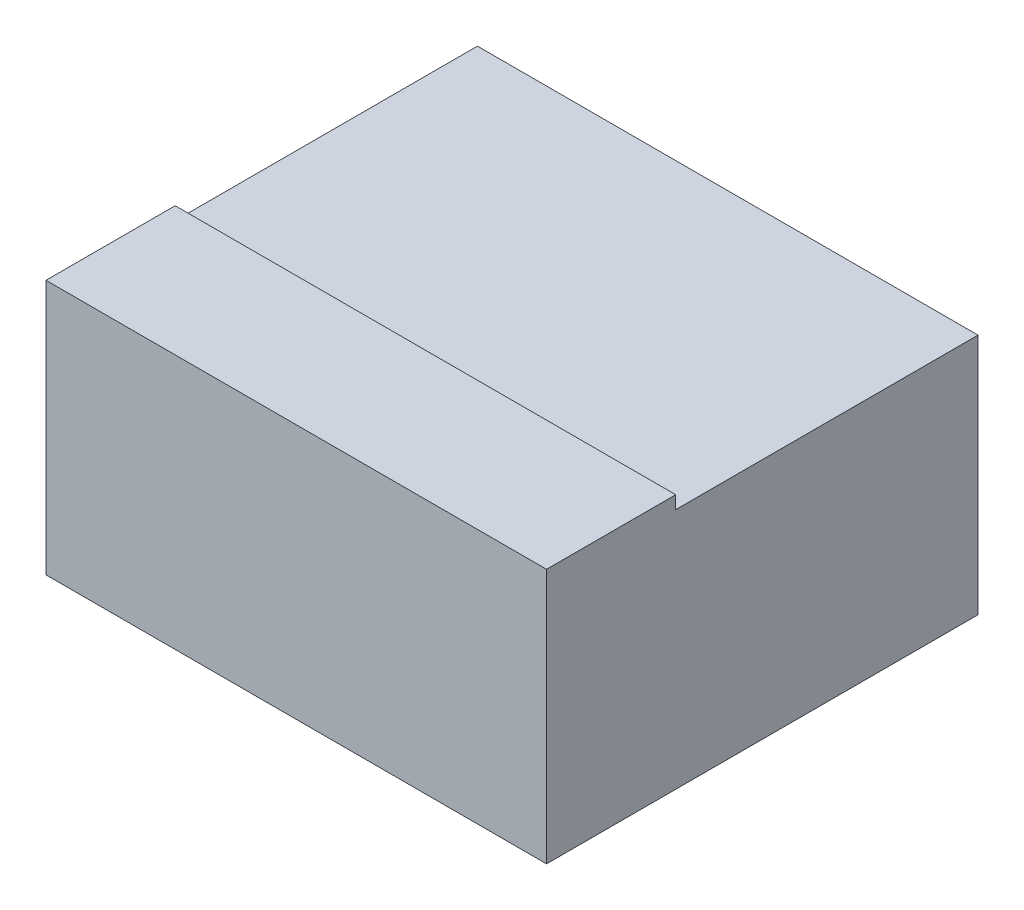
ISO-10303-21;
HEADER;
FILE_DESCRIPTION(('STEP AP214'),'2;1');
FILE_NAME('part.step','',(''),(''),'','','');
FILE_SCHEMA(('AUTOMOTIVE_DESIGN { 1 0 10303 214 1 1 1 1 }'));
ENDSEC;
DATA;
#1=APPLICATION_CONTEXT('core data for automotive mechanical design processes');
#2=APPLICATION_PROTOCOL_DEFINITION('international standard','automotive_design',2000,#1);
#3=PRODUCT_CONTEXT('',#1,'mechanical');
#4=PRODUCT('Part','Part','',(#3));
#5=PRODUCT_RELATED_PRODUCT_CATEGORY('part','',(#4));
#6=PRODUCT_DEFINITION_FORMATION('','',#4);
#7=PRODUCT_DEFINITION_CONTEXT('part definition',#1,'design');
#8=PRODUCT_DEFINITION('design','',#6,#7);
#9=PRODUCT_DEFINITION_SHAPE('','',#8);
#10=(LENGTH_UNIT() NAMED_UNIT(*) SI_UNIT(.MILLI.,.METRE.));
#11=(NAMED_UNIT(*) PLANE_ANGLE_UNIT() SI_UNIT($,.RADIAN.));
#12=(NAMED_UNIT(*) SI_UNIT($,.STERADIAN.) SOLID_ANGLE_UNIT());
#13=UNCERTAINTY_MEASURE_WITH_UNIT(LENGTH_MEASURE(1.E-05),#10,'distance_accuracy_value','');
#14=(GEOMETRIC_REPRESENTATION_CONTEXT(3) GLOBAL_UNCERTAINTY_ASSIGNED_CONTEXT((#13)) GLOBAL_UNIT_ASSIGNED_CONTEXT((#10,
#11,#12)) REPRESENTATION_CONTEXT('',''));
#15=CARTESIAN_POINT('',(0.,0.,0.));
#16=DIRECTION('',(0.,0.,1.));
#17=DIRECTION('',(1.,0.,0.));
#18=AXIS2_PLACEMENT_3D('',#15,#16,#17);
#19=CARTESIAN_POINT('',(-38.75,37.5,-33.4));
#20=DIRECTION('',(1.,0.,0.));
#21=DIRECTION('',(0.,0.,-1.));
#22=AXIS2_PLACEMENT_3D('',#19,#20,#21);
#23=PLANE('',#22);
#24=DIRECTION('',(0.,0.,-1.));
#25=VECTOR('',#24,1.);
#26=CARTESIAN_POINT('',(-38.75,12.,-33.4));
#27=LINE('',#26,#25);
#28=CARTESIAN_POINT('',(-38.75,12.,-21.4));
#29=VERTEX_POINT('',#28);
#30=CARTESIAN_POINT('',(-38.75,12.,-33.4));
#31=VERTEX_POINT('',#30);
#32=EDGE_CURVE('E134',#29,#31,#27,.T.);
#33=ORIENTED_EDGE('',*,*,#32,.F.);
#34=DIRECTION('',(0.,1.,0.));
#35=VECTOR('',#34,1.);
#36=CARTESIAN_POINT('',(-38.75,0.,-21.4));
#37=LINE('',#36,#35);
#38=CARTESIAN_POINT('',(-38.75,0.,-21.4));
#39=VERTEX_POINT('',#38);
#40=EDGE_CURVE('E56',#39,#29,#37,.T.);
#41=ORIENTED_EDGE('',*,*,#40,.F.);
#42=DIRECTION('',(0.,0.,1.));
#43=VECTOR('',#42,1.);
#44=CARTESIAN_POINT('',(-38.75,0.,-33.4));
#45=LINE('',#44,#43);
#46=CARTESIAN_POINT('',(-38.75,0.,33.4));
#47=VERTEX_POINT('',#46);
#48=EDGE_CURVE('E118',#39,#47,#45,.T.);
#49=ORIENTED_EDGE('',*,*,#48,.T.);
#50=DIRECTION('',(0.,-1.,0.));
#51=VECTOR('',#50,1.);
#52=CARTESIAN_POINT('',(-38.75,37.5,33.4));
#53=LINE('',#52,#51);
#54=CARTESIAN_POINT('',(-38.75,39.5,33.4));
#55=VERTEX_POINT('',#54);
#56=EDGE_CURVE('E181',#55,#47,#53,.T.);
#57=ORIENTED_EDGE('',*,*,#56,.F.);
#58=DIRECTION('',(0.,0.,1.));
#59=VECTOR('',#58,1.);
#60=CARTESIAN_POINT('',(-38.75,39.5,33.4));
#61=LINE('',#60,#59);
#62=CARTESIAN_POINT('',(-38.75,39.5,13.4));
#63=VERTEX_POINT('',#62);
#64=EDGE_CURVE('E153',#63,#55,#61,.T.);
#65=ORIENTED_EDGE('',*,*,#64,.F.);
#66=DIRECTION('',(0.,-1.,0.));
#67=VECTOR('',#66,1.);
#68=CARTESIAN_POINT('',(-38.75,39.5,13.4));
#69=LINE('',#68,#67);
#70=CARTESIAN_POINT('',(-38.75,37.5,13.4));
#71=VERTEX_POINT('',#70);
#72=EDGE_CURVE('E157',#63,#71,#69,.T.);
#73=ORIENTED_EDGE('',*,*,#72,.T.);
#74=DIRECTION('',(0.,0.,1.));
#75=VECTOR('',#74,1.);
#76=CARTESIAN_POINT('',(-38.75,37.5,-33.4));
#77=LINE('',#76,#75);
#78=CARTESIAN_POINT('',(-38.75,37.5,-33.4));
#79=VERTEX_POINT('',#78);
#80=EDGE_CURVE('E173',#79,#71,#77,.T.);
#81=ORIENTED_EDGE('',*,*,#80,.F.);
#82=DIRECTION('',(0.,-1.,0.));
#83=VECTOR('',#82,1.);
#84=CARTESIAN_POINT('',(-38.75,37.5,-33.4));
#85=LINE('',#84,#83);
#86=EDGE_CURVE('E50',#79,#31,#85,.T.);
#87=ORIENTED_EDGE('',*,*,#86,.T.);
#88=EDGE_LOOP('',(#33,#41,#49,#57,#65,#73,#81,#87));
#89=FACE_BOUND('',#88,.T.);
#90=ADVANCED_FACE('F39',(#89),#23,.F.);
#91=CARTESIAN_POINT('',(38.75,37.5,-33.4));
#92=DIRECTION('',(-1.,0.,0.));
#93=DIRECTION('',(0.,0.,1.));
#94=AXIS2_PLACEMENT_3D('',#91,#92,#93);
#95=PLANE('',#94);
#96=DIRECTION('',(0.,0.,-1.));
#97=VECTOR('',#96,1.);
#98=CARTESIAN_POINT('',(38.75,0.,-33.4));
#99=LINE('',#98,#97);
#100=CARTESIAN_POINT('',(38.75,0.,33.4));
#101=VERTEX_POINT('',#100);
#102=CARTESIAN_POINT('',(38.75,0.,-33.4));
#103=VERTEX_POINT('',#102);
#104=EDGE_CURVE('E119',#101,#103,#99,.T.);
#105=ORIENTED_EDGE('',*,*,#104,.T.);
#106=DIRECTION('',(0.,-1.,0.));
#107=VECTOR('',#106,1.);
#108=CARTESIAN_POINT('',(38.75,37.5,-33.4));
#109=LINE('',#108,#107);
#110=CARTESIAN_POINT('',(38.75,37.5,-33.4));
#111=VERTEX_POINT('',#110);
#112=EDGE_CURVE('E11',#111,#103,#109,.T.);
#113=ORIENTED_EDGE('',*,*,#112,.F.);
#114=DIRECTION('',(0.,0.,-1.));
#115=VECTOR('',#114,1.);
#116=CARTESIAN_POINT('',(38.75,37.5,-33.4));
#117=LINE('',#116,#115);
#118=CARTESIAN_POINT('',(38.75,37.5,13.4));
#119=VERTEX_POINT('',#118);
#120=EDGE_CURVE('E166',#119,#111,#117,.T.);
#121=ORIENTED_EDGE('',*,*,#120,.F.);
#122=DIRECTION('',(0.,-1.,0.));
#123=VECTOR('',#122,1.);
#124=CARTESIAN_POINT('',(38.75,39.5,13.4));
#125=LINE('',#124,#123);
#126=CARTESIAN_POINT('',(38.75,39.5,13.4));
#127=VERTEX_POINT('',#126);
#128=EDGE_CURVE('E164',#127,#119,#125,.T.);
#129=ORIENTED_EDGE('',*,*,#128,.F.);
#130=DIRECTION('',(0.,0.,-1.));
#131=VECTOR('',#130,1.);
#132=CARTESIAN_POINT('',(38.75,39.5,33.4));
#133=LINE('',#132,#131);
#134=CARTESIAN_POINT('',(38.75,39.5,33.4));
#135=VERTEX_POINT('',#134);
#136=EDGE_CURVE('E146',#135,#127,#133,.T.);
#137=ORIENTED_EDGE('',*,*,#136,.F.);
#138=DIRECTION('',(0.,-1.,0.));
#139=VECTOR('',#138,1.);
#140=CARTESIAN_POINT('',(38.75,37.5,33.4));
#141=LINE('',#140,#139);
#142=EDGE_CURVE('E174',#135,#101,#141,.T.);
#143=ORIENTED_EDGE('',*,*,#142,.T.);
#144=EDGE_LOOP('',(#105,#113,#121,#129,#137,#143));
#145=FACE_BOUND('',#144,.T.);
#146=ADVANCED_FACE('F41',(#145),#95,.F.);
#147=CARTESIAN_POINT('',(-38.75,37.5,-33.4));
#148=DIRECTION('',(0.,0.,1.));
#149=DIRECTION('',(1.,0.,0.));
#150=AXIS2_PLACEMENT_3D('',#147,#148,#149);
#151=PLANE('',#150);
#152=DIRECTION('',(-1.,0.,0.));
#153=VECTOR('',#152,1.);
#154=CARTESIAN_POINT('',(-38.75,0.,-33.4));
#155=LINE('',#154,#153);
#156=CARTESIAN_POINT('',(-43.75,0.,-33.4));
#157=VERTEX_POINT('',#156);
#158=EDGE_CURVE('E108',#103,#157,#155,.T.);
#159=ORIENTED_EDGE('',*,*,#158,.T.);
#160=DIRECTION('',(0.,-1.,0.));
#161=VECTOR('',#160,1.);
#162=CARTESIAN_POINT('',(-43.75,0.,-33.4));
#163=LINE('',#162,#161);
#164=CARTESIAN_POINT('',(-43.75,12.,-33.4));
#165=VERTEX_POINT('',#164);
#166=EDGE_CURVE('E113',#165,#157,#163,.T.);
#167=ORIENTED_EDGE('',*,*,#166,.F.);
#168=DIRECTION('',(1.,0.,0.));
#169=VECTOR('',#168,1.);
#170=CARTESIAN_POINT('',(-43.75,12.,-33.4));
#171=LINE('',#170,#169);
#172=EDGE_CURVE('E142',#165,#31,#171,.T.);
#173=ORIENTED_EDGE('',*,*,#172,.T.);
#174=ORIENTED_EDGE('',*,*,#86,.F.);
#175=DIRECTION('',(-1.,0.,0.));
#176=VECTOR('',#175,1.);
#177=CARTESIAN_POINT('',(-38.75,37.5,-33.4));
#178=LINE('',#177,#176);
#179=EDGE_CURVE('E167',#111,#79,#178,.T.);
#180=ORIENTED_EDGE('',*,*,#179,.F.);
#181=ORIENTED_EDGE('',*,*,#112,.T.);
#182=EDGE_LOOP('',(#159,#167,#173,#174,#180,#181));
#183=FACE_BOUND('',#182,.T.);
#184=ADVANCED_FACE('F109',(#183),#151,.F.);
#185=CARTESIAN_POINT('',(-38.75,37.5,33.4));
#186=DIRECTION('',(0.,0.,-1.));
#187=DIRECTION('',(-1.,0.,0.));
#188=AXIS2_PLACEMENT_3D('',#185,#186,#187);
#189=PLANE('',#188);
#190=DIRECTION('',(1.,0.,0.));
#191=VECTOR('',#190,1.);
#192=CARTESIAN_POINT('',(-38.75,0.,33.4));
#193=LINE('',#192,#191);
#194=EDGE_CURVE('E171',#47,#101,#193,.T.);
#195=ORIENTED_EDGE('',*,*,#194,.T.);
#196=ORIENTED_EDGE('',*,*,#142,.F.);
#197=DIRECTION('',(1.,0.,0.));
#198=VECTOR('',#197,1.);
#199=CARTESIAN_POINT('',(38.75,39.5,33.4));
#200=LINE('',#199,#198);
#201=EDGE_CURVE('E156',#55,#135,#200,.T.);
#202=ORIENTED_EDGE('',*,*,#201,.F.);
#203=ORIENTED_EDGE('',*,*,#56,.T.);
#204=EDGE_LOOP('',(#195,#196,#202,#203));
#205=FACE_BOUND('',#204,.T.);
#206=ADVANCED_FACE('F187',(#205),#189,.F.);
#207=CARTESIAN_POINT('',(0.,37.5,0.));
#208=DIRECTION('',(0.,1.,0.));
#209=DIRECTION('',(0.,0.,1.));
#210=AXIS2_PLACEMENT_3D('',#207,#208,#209);
#211=PLANE('',#210);
#212=DIRECTION('',(-1.,0.,0.));
#213=VECTOR('',#212,1.);
#214=CARTESIAN_POINT('',(38.75,37.5,13.4));
#215=LINE('',#214,#213);
#216=EDGE_CURVE('E149',#119,#71,#215,.T.);
#217=ORIENTED_EDGE('',*,*,#216,.F.);
#218=ORIENTED_EDGE('',*,*,#120,.T.);
#219=ORIENTED_EDGE('',*,*,#179,.T.);
#220=ORIENTED_EDGE('',*,*,#80,.T.);
#221=EDGE_LOOP('',(#217,#218,#219,#220));
#222=FACE_BOUND('',#221,.T.);
#223=ADVANCED_FACE('F197',(#222),#211,.T.);
#224=CARTESIAN_POINT('',(0.,0.,0.));
#225=DIRECTION('',(0.,1.,0.));
#226=DIRECTION('',(0.,0.,1.));
#227=AXIS2_PLACEMENT_3D('',#224,#225,#226);
#228=PLANE('',#227);
#229=ORIENTED_EDGE('',*,*,#104,.F.);
#230=ORIENTED_EDGE('',*,*,#194,.F.);
#231=ORIENTED_EDGE('',*,*,#48,.F.);
#232=DIRECTION('',(1.,0.,0.));
#233=VECTOR('',#232,1.);
#234=CARTESIAN_POINT('',(-43.75,0.,-21.4));
#235=LINE('',#234,#233);
#236=CARTESIAN_POINT('',(-43.75,0.,-21.4));
#237=VERTEX_POINT('',#236);
#238=EDGE_CURVE('E127',#237,#39,#235,.T.);
#239=ORIENTED_EDGE('',*,*,#238,.F.);
#240=DIRECTION('',(0.,0.,1.));
#241=VECTOR('',#240,1.);
#242=CARTESIAN_POINT('',(-43.75,0.,-33.4));
#243=LINE('',#242,#241);
#244=EDGE_CURVE('E124',#157,#237,#243,.T.);
#245=ORIENTED_EDGE('',*,*,#244,.F.);
#246=ORIENTED_EDGE('',*,*,#158,.F.);
#247=EDGE_LOOP('',(#229,#230,#231,#239,#245,#246));
#248=FACE_BOUND('',#247,.T.);
#249=ADVANCED_FACE('F121',(#248),#228,.F.);
#250=CARTESIAN_POINT('',(38.75,39.5,13.4));
#251=DIRECTION('',(0.,0.,1.));
#252=DIRECTION('',(1.,0.,0.));
#253=AXIS2_PLACEMENT_3D('',#250,#251,#252);
#254=PLANE('',#253);
#255=ORIENTED_EDGE('',*,*,#216,.T.);
#256=ORIENTED_EDGE('',*,*,#72,.F.);
#257=DIRECTION('',(-1.,0.,0.));
#258=VECTOR('',#257,1.);
#259=CARTESIAN_POINT('',(38.75,39.5,13.4));
#260=LINE('',#259,#258);
#261=EDGE_CURVE('E155',#127,#63,#260,.T.);
#262=ORIENTED_EDGE('',*,*,#261,.F.);
#263=ORIENTED_EDGE('',*,*,#128,.T.);
#264=EDGE_LOOP('',(#255,#256,#262,#263));
#265=FACE_BOUND('',#264,.T.);
#266=ADVANCED_FACE('F196',(#265),#254,.F.);
#267=CARTESIAN_POINT('',(0.,39.5,0.));
#268=DIRECTION('',(0.,1.,0.));
#269=DIRECTION('',(0.,0.,1.));
#270=AXIS2_PLACEMENT_3D('',#267,#268,#269);
#271=PLANE('',#270);
#272=ORIENTED_EDGE('',*,*,#136,.T.);
#273=ORIENTED_EDGE('',*,*,#261,.T.);
#274=ORIENTED_EDGE('',*,*,#64,.T.);
#275=ORIENTED_EDGE('',*,*,#201,.T.);
#276=EDGE_LOOP('',(#272,#273,#274,#275));
#277=FACE_BOUND('',#276,.T.);
#278=ADVANCED_FACE('F194',(#277),#271,.T.);
#279=CARTESIAN_POINT('',(-43.75,0.,-21.4));
#280=DIRECTION('',(0.,0.,-1.));
#281=DIRECTION('',(-1.,0.,0.));
#282=AXIS2_PLACEMENT_3D('',#279,#280,#281);
#283=PLANE('',#282);
#284=ORIENTED_EDGE('',*,*,#40,.T.);
#285=DIRECTION('',(1.,0.,0.));
#286=VECTOR('',#285,1.);
#287=CARTESIAN_POINT('',(-43.75,12.,-21.4));
#288=LINE('',#287,#286);
#289=CARTESIAN_POINT('',(-43.75,12.,-21.4));
#290=VERTEX_POINT('',#289);
#291=EDGE_CURVE('E144',#290,#29,#288,.T.);
#292=ORIENTED_EDGE('',*,*,#291,.F.);
#293=DIRECTION('',(0.,1.,0.));
#294=VECTOR('',#293,1.);
#295=CARTESIAN_POINT('',(-43.75,0.,-21.4));
#296=LINE('',#295,#294);
#297=EDGE_CURVE('E126',#237,#290,#296,.T.);
#298=ORIENTED_EDGE('',*,*,#297,.F.);
#299=ORIENTED_EDGE('',*,*,#238,.T.);
#300=EDGE_LOOP('',(#284,#292,#298,#299));
#301=FACE_BOUND('',#300,.T.);
#302=ADVANCED_FACE('F205',(#301),#283,.F.);
#303=CARTESIAN_POINT('',(-43.75,12.,-33.4));
#304=DIRECTION('',(0.,-1.,0.));
#305=DIRECTION('',(0.,0.,-1.));
#306=AXIS2_PLACEMENT_3D('',#303,#304,#305);
#307=PLANE('',#306);
#308=ORIENTED_EDGE('',*,*,#32,.T.);
#309=ORIENTED_EDGE('',*,*,#172,.F.);
#310=DIRECTION('',(0.,0.,-1.));
#311=VECTOR('',#310,1.);
#312=CARTESIAN_POINT('',(-43.75,12.,-33.4));
#313=LINE('',#312,#311);
#314=EDGE_CURVE('E132',#290,#165,#313,.T.);
#315=ORIENTED_EDGE('',*,*,#314,.F.);
#316=ORIENTED_EDGE('',*,*,#291,.T.);
#317=EDGE_LOOP('',(#308,#309,#315,#316));
#318=FACE_BOUND('',#317,.T.);
#319=ADVANCED_FACE('F199',(#318),#307,.F.);
#320=CARTESIAN_POINT('',(-43.75,0.,0.));
#321=DIRECTION('',(1.,0.,0.));
#322=DIRECTION('',(0.,0.,-1.));
#323=AXIS2_PLACEMENT_3D('',#320,#321,#322);
#324=PLANE('',#323);
#325=ORIENTED_EDGE('',*,*,#166,.T.);
#326=ORIENTED_EDGE('',*,*,#244,.T.);
#327=ORIENTED_EDGE('',*,*,#297,.T.);
#328=ORIENTED_EDGE('',*,*,#314,.T.);
#329=EDGE_LOOP('',(#325,#326,#327,#328));
#330=FACE_BOUND('',#329,.T.);
#331=ADVANCED_FACE('F131',(#330),#324,.F.);
#332=CLOSED_SHELL('',(#90,#146,#184,#206,#223,#249,#266,#278,#302,#319,#331));
#333=MANIFOLD_SOLID_BREP('B2',#332);
#334=ADVANCED_BREP_SHAPE_REPRESENTATION('',(#18,#333),#14);
#335=SHAPE_DEFINITION_REPRESENTATION(#9,#334);
ENDSEC;
END-ISO-10303-21;
